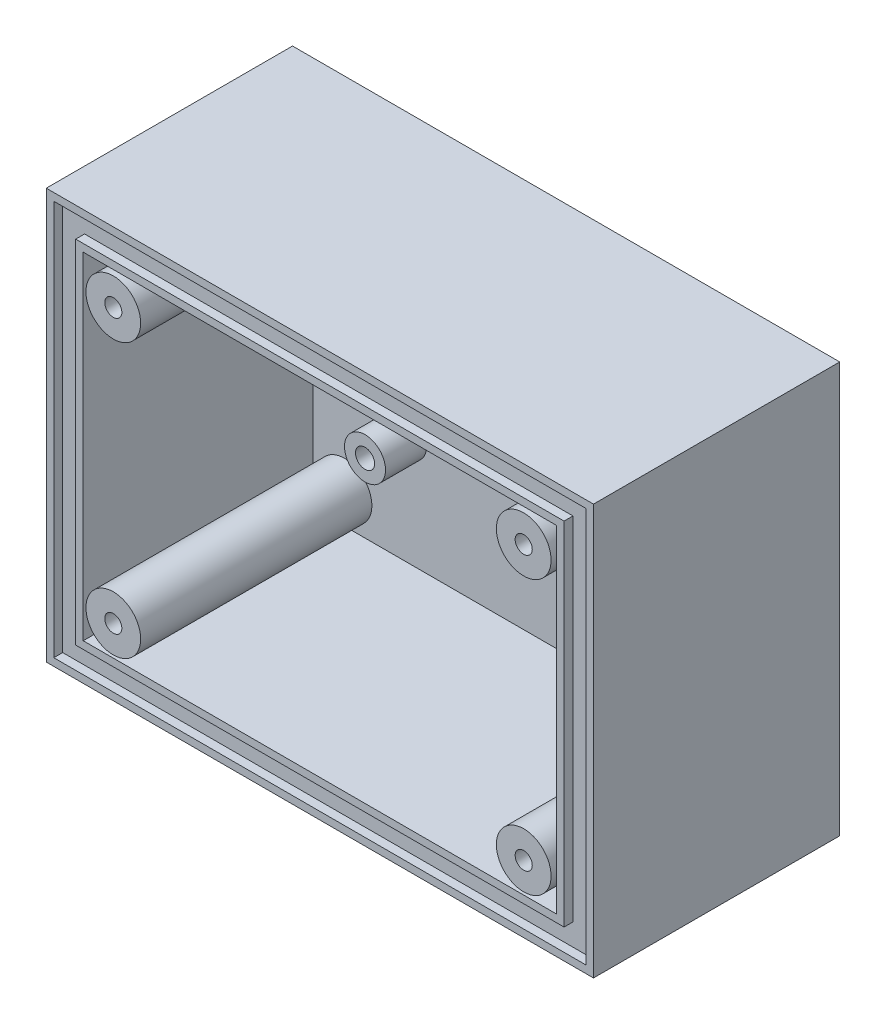
ISO-10303-21;
HEADER;
FILE_DESCRIPTION(('STEP AP214'),'2;1');
FILE_NAME('part.step','',(''),(''),'','','');
FILE_SCHEMA(('AUTOMOTIVE_DESIGN { 1 0 10303 214 1 1 1 1 }'));
ENDSEC;
DATA;
#1=APPLICATION_CONTEXT('core data for automotive mechanical design processes');
#2=APPLICATION_PROTOCOL_DEFINITION('international standard','automotive_design',2000,#1);
#3=PRODUCT_CONTEXT('',#1,'mechanical');
#4=PRODUCT('Part','Part','',(#3));
#5=PRODUCT_RELATED_PRODUCT_CATEGORY('part','',(#4));
#6=PRODUCT_DEFINITION_FORMATION('','',#4);
#7=PRODUCT_DEFINITION_CONTEXT('part definition',#1,'design');
#8=PRODUCT_DEFINITION('design','',#6,#7);
#9=PRODUCT_DEFINITION_SHAPE('','',#8);
#10=(LENGTH_UNIT() NAMED_UNIT(*) SI_UNIT(.MILLI.,.METRE.));
#11=(NAMED_UNIT(*) PLANE_ANGLE_UNIT() SI_UNIT($,.RADIAN.));
#12=(NAMED_UNIT(*) SI_UNIT($,.STERADIAN.) SOLID_ANGLE_UNIT());
#13=UNCERTAINTY_MEASURE_WITH_UNIT(LENGTH_MEASURE(1.E-05),#10,'distance_accuracy_value','');
#14=(GEOMETRIC_REPRESENTATION_CONTEXT(3) GLOBAL_UNCERTAINTY_ASSIGNED_CONTEXT((#13)) GLOBAL_UNIT_ASSIGNED_CONTEXT((#10,
#11,#12)) REPRESENTATION_CONTEXT('',''));
#15=CARTESIAN_POINT('',(0.,0.,0.));
#16=DIRECTION('',(0.,0.,1.));
#17=DIRECTION('',(1.,0.,0.));
#18=AXIS2_PLACEMENT_3D('',#15,#16,#17);
#19=CARTESIAN_POINT('',(0.,0.,34.7));
#20=DIRECTION('',(0.,0.,-1.));
#21=DIRECTION('',(-1.,0.,0.));
#22=AXIS2_PLACEMENT_3D('',#19,#20,#21);
#23=PLANE('',#22);
#24=DIRECTION('',(-1.,0.,0.));
#25=VECTOR('',#24,1.);
#26=CARTESIAN_POINT('',(-38.9,28.9,34.7));
#27=LINE('',#26,#25);
#28=CARTESIAN_POINT('',(38.9,28.9,34.7));
#29=VERTEX_POINT('',#28);
#30=CARTESIAN_POINT('',(-38.9,28.9,34.7));
#31=VERTEX_POINT('',#30);
#32=EDGE_CURVE('E216',#29,#31,#27,.T.);
#33=ORIENTED_EDGE('',*,*,#32,.T.);
#34=DIRECTION('',(0.,-1.,0.));
#35=VECTOR('',#34,1.);
#36=CARTESIAN_POINT('',(-38.9,-28.9,34.7));
#37=LINE('',#36,#35);
#38=CARTESIAN_POINT('',(-38.9,-28.9,34.7));
#39=VERTEX_POINT('',#38);
#40=EDGE_CURVE('E212',#31,#39,#37,.T.);
#41=ORIENTED_EDGE('',*,*,#40,.T.);
#42=DIRECTION('',(1.,0.,0.));
#43=VECTOR('',#42,1.);
#44=CARTESIAN_POINT('',(-38.9,-28.9,34.7));
#45=LINE('',#44,#43);
#46=CARTESIAN_POINT('',(38.9,-28.9,34.7));
#47=VERTEX_POINT('',#46);
#48=EDGE_CURVE('E226',#39,#47,#45,.T.);
#49=ORIENTED_EDGE('',*,*,#48,.T.);
#50=DIRECTION('',(0.,1.,0.));
#51=VECTOR('',#50,1.);
#52=CARTESIAN_POINT('',(38.9,-28.9,34.7));
#53=LINE('',#52,#51);
#54=EDGE_CURVE('E229',#47,#29,#53,.T.);
#55=ORIENTED_EDGE('',*,*,#54,.T.);
#56=EDGE_LOOP('',(#33,#41,#49,#55));
#57=FACE_BOUND('',#56,.T.);
#58=DIRECTION('',(0.,-1.,0.));
#59=VECTOR('',#58,1.);
#60=CARTESIAN_POINT('',(-35.7,-25.7,34.7));
#61=LINE('',#60,#59);
#62=CARTESIAN_POINT('',(-35.7,25.7,34.7));
#63=VERTEX_POINT('',#62);
#64=CARTESIAN_POINT('',(-35.7,-25.7,34.7));
#65=VERTEX_POINT('',#64);
#66=EDGE_CURVE('E184',#63,#65,#61,.T.);
#67=ORIENTED_EDGE('',*,*,#66,.F.);
#68=DIRECTION('',(-1.,0.,0.));
#69=VECTOR('',#68,1.);
#70=CARTESIAN_POINT('',(-35.7,25.7,34.7));
#71=LINE('',#70,#69);
#72=CARTESIAN_POINT('',(35.7,25.7,34.7));
#73=VERTEX_POINT('',#72);
#74=EDGE_CURVE('E189',#73,#63,#71,.T.);
#75=ORIENTED_EDGE('',*,*,#74,.F.);
#76=DIRECTION('',(0.,1.,0.));
#77=VECTOR('',#76,1.);
#78=CARTESIAN_POINT('',(35.7,-25.7,34.7));
#79=LINE('',#78,#77);
#80=CARTESIAN_POINT('',(35.7,-25.7,34.7));
#81=VERTEX_POINT('',#80);
#82=EDGE_CURVE('E61',#81,#73,#79,.T.);
#83=ORIENTED_EDGE('',*,*,#82,.F.);
#84=DIRECTION('',(1.,0.,0.));
#85=VECTOR('',#84,1.);
#86=CARTESIAN_POINT('',(-35.7,-25.7,34.7));
#87=LINE('',#86,#85);
#88=EDGE_CURVE('E56',#65,#81,#87,.T.);
#89=ORIENTED_EDGE('',*,*,#88,.F.);
#90=EDGE_LOOP('',(#67,#75,#83,#89));
#91=FACE_BOUND('',#90,.T.);
#92=ADVANCED_FACE('F41',(#57,#91),#23,.F.);
#93=CARTESIAN_POINT('',(0.,0.,36.));
#94=DIRECTION('',(0.,0.,-1.));
#95=DIRECTION('',(-1.,0.,0.));
#96=AXIS2_PLACEMENT_3D('',#93,#94,#95);
#97=PLANE('',#96);
#98=DIRECTION('',(0.,-1.,0.));
#99=VECTOR('',#98,1.);
#100=CARTESIAN_POINT('',(-40.,-30.,36.));
#101=LINE('',#100,#99);
#102=CARTESIAN_POINT('',(-40.,30.,36.));
#103=VERTEX_POINT('',#102);
#104=CARTESIAN_POINT('',(-40.,-30.,36.));
#105=VERTEX_POINT('',#104);
#106=EDGE_CURVE('E242',#103,#105,#101,.T.);
#107=ORIENTED_EDGE('',*,*,#106,.T.);
#108=DIRECTION('',(1.,0.,0.));
#109=VECTOR('',#108,1.);
#110=CARTESIAN_POINT('',(-40.,-30.,36.));
#111=LINE('',#110,#109);
#112=CARTESIAN_POINT('',(40.,-30.,36.));
#113=VERTEX_POINT('',#112);
#114=EDGE_CURVE('E245',#105,#113,#111,.T.);
#115=ORIENTED_EDGE('',*,*,#114,.T.);
#116=DIRECTION('',(0.,1.,0.));
#117=VECTOR('',#116,1.);
#118=CARTESIAN_POINT('',(40.,-30.,36.));
#119=LINE('',#118,#117);
#120=CARTESIAN_POINT('',(40.,30.,36.));
#121=VERTEX_POINT('',#120);
#122=EDGE_CURVE('E248',#113,#121,#119,.T.);
#123=ORIENTED_EDGE('',*,*,#122,.T.);
#124=DIRECTION('',(-1.,0.,0.));
#125=VECTOR('',#124,1.);
#126=CARTESIAN_POINT('',(-40.,30.,36.));
#127=LINE('',#126,#125);
#128=EDGE_CURVE('E251',#121,#103,#127,.T.);
#129=ORIENTED_EDGE('',*,*,#128,.T.);
#130=EDGE_LOOP('',(#107,#115,#123,#129));
#131=FACE_BOUND('',#130,.T.);
#132=DIRECTION('',(0.,-1.,0.));
#133=VECTOR('',#132,1.);
#134=CARTESIAN_POINT('',(-38.9,-28.9,36.));
#135=LINE('',#134,#133);
#136=CARTESIAN_POINT('',(-38.9,28.9,36.));
#137=VERTEX_POINT('',#136);
#138=CARTESIAN_POINT('',(-38.9,-28.9,36.));
#139=VERTEX_POINT('',#138);
#140=EDGE_CURVE('E213',#137,#139,#135,.T.);
#141=ORIENTED_EDGE('',*,*,#140,.F.);
#142=DIRECTION('',(-1.,0.,0.));
#143=VECTOR('',#142,1.);
#144=CARTESIAN_POINT('',(-38.9,28.9,36.));
#145=LINE('',#144,#143);
#146=CARTESIAN_POINT('',(38.9,28.9,36.));
#147=VERTEX_POINT('',#146);
#148=EDGE_CURVE('E221',#147,#137,#145,.T.);
#149=ORIENTED_EDGE('',*,*,#148,.F.);
#150=DIRECTION('',(0.,1.,0.));
#151=VECTOR('',#150,1.);
#152=CARTESIAN_POINT('',(38.9,-28.9,36.));
#153=LINE('',#152,#151);
#154=CARTESIAN_POINT('',(38.9,-28.9,36.));
#155=VERTEX_POINT('',#154);
#156=EDGE_CURVE('E218',#155,#147,#153,.T.);
#157=ORIENTED_EDGE('',*,*,#156,.F.);
#158=DIRECTION('',(1.,0.,0.));
#159=VECTOR('',#158,1.);
#160=CARTESIAN_POINT('',(-38.9,-28.9,36.));
#161=LINE('',#160,#159);
#162=EDGE_CURVE('E215',#139,#155,#161,.T.);
#163=ORIENTED_EDGE('',*,*,#162,.F.);
#164=EDGE_LOOP('',(#141,#149,#157,#163));
#165=FACE_BOUND('',#164,.T.);
#166=ADVANCED_FACE('F344',(#131,#165),#97,.F.);
#167=CARTESIAN_POINT('',(-38.9,-28.9,36.));
#168=DIRECTION('',(1.,0.,0.));
#169=DIRECTION('',(0.,0.,-1.));
#170=AXIS2_PLACEMENT_3D('',#167,#168,#169);
#171=PLANE('',#170);
#172=ORIENTED_EDGE('',*,*,#40,.F.);
#173=DIRECTION('',(0.,0.,-1.));
#174=VECTOR('',#173,1.);
#175=CARTESIAN_POINT('',(-38.9,28.9,36.));
#176=LINE('',#175,#174);
#177=EDGE_CURVE('E223',#137,#31,#176,.T.);
#178=ORIENTED_EDGE('',*,*,#177,.F.);
#179=ORIENTED_EDGE('',*,*,#140,.T.);
#180=DIRECTION('',(0.,0.,-1.));
#181=VECTOR('',#180,1.);
#182=CARTESIAN_POINT('',(-38.9,-28.9,36.));
#183=LINE('',#182,#181);
#184=EDGE_CURVE('E239',#139,#39,#183,.T.);
#185=ORIENTED_EDGE('',*,*,#184,.T.);
#186=EDGE_LOOP('',(#172,#178,#179,#185));
#187=FACE_BOUND('',#186,.T.);
#188=ADVANCED_FACE('F352',(#187),#171,.T.);
#189=CARTESIAN_POINT('',(-38.9,-28.9,36.));
#190=DIRECTION('',(0.,1.,0.));
#191=DIRECTION('',(0.,0.,1.));
#192=AXIS2_PLACEMENT_3D('',#189,#190,#191);
#193=PLANE('',#192);
#194=ORIENTED_EDGE('',*,*,#48,.F.);
#195=ORIENTED_EDGE('',*,*,#184,.F.);
#196=ORIENTED_EDGE('',*,*,#162,.T.);
#197=DIRECTION('',(0.,0.,-1.));
#198=VECTOR('',#197,1.);
#199=CARTESIAN_POINT('',(38.9,-28.9,36.));
#200=LINE('',#199,#198);
#201=EDGE_CURVE('E237',#155,#47,#200,.T.);
#202=ORIENTED_EDGE('',*,*,#201,.T.);
#203=EDGE_LOOP('',(#194,#195,#196,#202));
#204=FACE_BOUND('',#203,.T.);
#205=ADVANCED_FACE('F392',(#204),#193,.T.);
#206=CARTESIAN_POINT('',(38.9,-28.9,36.));
#207=DIRECTION('',(-1.,0.,0.));
#208=DIRECTION('',(0.,0.,1.));
#209=AXIS2_PLACEMENT_3D('',#206,#207,#208);
#210=PLANE('',#209);
#211=ORIENTED_EDGE('',*,*,#54,.F.);
#212=ORIENTED_EDGE('',*,*,#201,.F.);
#213=ORIENTED_EDGE('',*,*,#156,.T.);
#214=DIRECTION('',(0.,0.,-1.));
#215=VECTOR('',#214,1.);
#216=CARTESIAN_POINT('',(38.9,28.9,36.));
#217=LINE('',#216,#215);
#218=EDGE_CURVE('E235',#147,#29,#217,.T.);
#219=ORIENTED_EDGE('',*,*,#218,.T.);
#220=EDGE_LOOP('',(#211,#212,#213,#219));
#221=FACE_BOUND('',#220,.T.);
#222=ADVANCED_FACE('F398',(#221),#210,.T.);
#223=CARTESIAN_POINT('',(-38.9,28.9,36.));
#224=DIRECTION('',(0.,-1.,0.));
#225=DIRECTION('',(0.,0.,-1.));
#226=AXIS2_PLACEMENT_3D('',#223,#224,#225);
#227=PLANE('',#226);
#228=ORIENTED_EDGE('',*,*,#32,.F.);
#229=ORIENTED_EDGE('',*,*,#218,.F.);
#230=ORIENTED_EDGE('',*,*,#148,.T.);
#231=ORIENTED_EDGE('',*,*,#177,.T.);
#232=EDGE_LOOP('',(#228,#229,#230,#231));
#233=FACE_BOUND('',#232,.T.);
#234=ADVANCED_FACE('F361',(#233),#227,.T.);
#235=CARTESIAN_POINT('',(0.,0.,0.));
#236=DIRECTION('',(0.,0.,-1.));
#237=DIRECTION('',(-1.,0.,0.));
#238=AXIS2_PLACEMENT_3D('',#235,#236,#237);
#239=PLANE('',#238);
#240=DIRECTION('',(0.,-1.,0.));
#241=VECTOR('',#240,1.);
#242=CARTESIAN_POINT('',(-40.,-30.,0.));
#243=LINE('',#242,#241);
#244=CARTESIAN_POINT('',(-40.,30.,0.));
#245=VERTEX_POINT('',#244);
#246=CARTESIAN_POINT('',(-40.,-30.,0.));
#247=VERTEX_POINT('',#246);
#248=EDGE_CURVE('E163',#245,#247,#243,.T.);
#249=ORIENTED_EDGE('',*,*,#248,.F.);
#250=DIRECTION('',(-1.,0.,0.));
#251=VECTOR('',#250,1.);
#252=CARTESIAN_POINT('',(-40.,30.,0.));
#253=LINE('',#252,#251);
#254=CARTESIAN_POINT('',(40.,30.,0.));
#255=VERTEX_POINT('',#254);
#256=EDGE_CURVE('E273',#255,#245,#253,.T.);
#257=ORIENTED_EDGE('',*,*,#256,.F.);
#258=DIRECTION('',(0.,1.,0.));
#259=VECTOR('',#258,1.);
#260=CARTESIAN_POINT('',(40.,-30.,0.));
#261=LINE('',#260,#259);
#262=CARTESIAN_POINT('',(40.,-30.,0.));
#263=VERTEX_POINT('',#262);
#264=EDGE_CURVE('E271',#263,#255,#261,.T.);
#265=ORIENTED_EDGE('',*,*,#264,.F.);
#266=DIRECTION('',(1.,0.,0.));
#267=VECTOR('',#266,1.);
#268=CARTESIAN_POINT('',(-40.,-30.,0.));
#269=LINE('',#268,#267);
#270=EDGE_CURVE('E269',#247,#263,#269,.T.);
#271=ORIENTED_EDGE('',*,*,#270,.F.);
#272=EDGE_LOOP('',(#249,#257,#265,#271));
#273=FACE_BOUND('',#272,.T.);
#274=ADVANCED_FACE('F357',(#273),#239,.T.);
#275=CARTESIAN_POINT('',(-40.,30.,2.4));
#276=DIRECTION('',(0.,-1.,0.));
#277=DIRECTION('',(0.,0.,-1.));
#278=AXIS2_PLACEMENT_3D('',#275,#276,#277);
#279=PLANE('',#278);
#280=ORIENTED_EDGE('',*,*,#256,.T.);
#281=DIRECTION('',(0.,0.,-1.));
#282=VECTOR('',#281,1.);
#283=CARTESIAN_POINT('',(-40.,30.,2.4));
#284=LINE('',#283,#282);
#285=EDGE_CURVE('E275',#103,#245,#284,.T.);
#286=ORIENTED_EDGE('',*,*,#285,.F.);
#287=ORIENTED_EDGE('',*,*,#128,.F.);
#288=DIRECTION('',(0.,0.,-1.));
#289=VECTOR('',#288,1.);
#290=CARTESIAN_POINT('',(40.,30.,2.4));
#291=LINE('',#290,#289);
#292=EDGE_CURVE('E278',#121,#255,#291,.T.);
#293=ORIENTED_EDGE('',*,*,#292,.T.);
#294=EDGE_LOOP('',(#280,#286,#287,#293));
#295=FACE_BOUND('',#294,.T.);
#296=ADVANCED_FACE('F360',(#295),#279,.F.);
#297=CARTESIAN_POINT('',(40.,-30.,2.4));
#298=DIRECTION('',(-1.,0.,0.));
#299=DIRECTION('',(0.,0.,1.));
#300=AXIS2_PLACEMENT_3D('',#297,#298,#299);
#301=PLANE('',#300);
#302=ORIENTED_EDGE('',*,*,#264,.T.);
#303=ORIENTED_EDGE('',*,*,#292,.F.);
#304=ORIENTED_EDGE('',*,*,#122,.F.);
#305=DIRECTION('',(0.,0.,-1.));
#306=VECTOR('',#305,1.);
#307=CARTESIAN_POINT('',(40.,-30.,2.4));
#308=LINE('',#307,#306);
#309=EDGE_CURVE('E281',#113,#263,#308,.T.);
#310=ORIENTED_EDGE('',*,*,#309,.T.);
#311=EDGE_LOOP('',(#302,#303,#304,#310));
#312=FACE_BOUND('',#311,.T.);
#313=ADVANCED_FACE('F365',(#312),#301,.F.);
#314=CARTESIAN_POINT('',(-40.,-30.,2.4));
#315=DIRECTION('',(0.,1.,0.));
#316=DIRECTION('',(0.,0.,1.));
#317=AXIS2_PLACEMENT_3D('',#314,#315,#316);
#318=PLANE('',#317);
#319=ORIENTED_EDGE('',*,*,#270,.T.);
#320=ORIENTED_EDGE('',*,*,#309,.F.);
#321=ORIENTED_EDGE('',*,*,#114,.F.);
#322=DIRECTION('',(0.,0.,-1.));
#323=VECTOR('',#322,1.);
#324=CARTESIAN_POINT('',(-40.,-30.,2.4));
#325=LINE('',#324,#323);
#326=EDGE_CURVE('E284',#105,#247,#325,.T.);
#327=ORIENTED_EDGE('',*,*,#326,.T.);
#328=EDGE_LOOP('',(#319,#320,#321,#327));
#329=FACE_BOUND('',#328,.T.);
#330=ADVANCED_FACE('F368',(#329),#318,.F.);
#331=CARTESIAN_POINT('',(-40.,-30.,2.4));
#332=DIRECTION('',(1.,0.,0.));
#333=DIRECTION('',(0.,0.,-1.));
#334=AXIS2_PLACEMENT_3D('',#331,#332,#333);
#335=PLANE('',#334);
#336=ORIENTED_EDGE('',*,*,#248,.T.);
#337=ORIENTED_EDGE('',*,*,#326,.F.);
#338=ORIENTED_EDGE('',*,*,#106,.F.);
#339=ORIENTED_EDGE('',*,*,#285,.T.);
#340=EDGE_LOOP('',(#336,#337,#338,#339));
#341=FACE_BOUND('',#340,.T.);
#342=ADVANCED_FACE('F43',(#341),#335,.F.);
#343=CARTESIAN_POINT('',(0.,0.,36.));
#344=DIRECTION('',(0.,0.,-1.));
#345=DIRECTION('',(-1.,0.,0.));
#346=AXIS2_PLACEMENT_3D('',#343,#344,#345);
#347=PLANE('',#346);
#348=DIRECTION('',(0.,-1.,0.));
#349=VECTOR('',#348,1.);
#350=CARTESIAN_POINT('',(-35.7,-25.7,36.));
#351=LINE('',#350,#349);
#352=CARTESIAN_POINT('',(-35.7,25.7,36.));
#353=VERTEX_POINT('',#352);
#354=CARTESIAN_POINT('',(-35.7,-25.7,36.));
#355=VERTEX_POINT('',#354);
#356=EDGE_CURVE('E185',#353,#355,#351,.T.);
#357=ORIENTED_EDGE('',*,*,#356,.T.);
#358=DIRECTION('',(1.,0.,0.));
#359=VECTOR('',#358,1.);
#360=CARTESIAN_POINT('',(-35.7,-25.7,36.));
#361=LINE('',#360,#359);
#362=CARTESIAN_POINT('',(35.7,-25.7,36.));
#363=VERTEX_POINT('',#362);
#364=EDGE_CURVE('E188',#355,#363,#361,.T.);
#365=ORIENTED_EDGE('',*,*,#364,.T.);
#366=DIRECTION('',(0.,1.,0.));
#367=VECTOR('',#366,1.);
#368=CARTESIAN_POINT('',(35.7,-25.7,36.));
#369=LINE('',#368,#367);
#370=CARTESIAN_POINT('',(35.7,25.7,36.));
#371=VERTEX_POINT('',#370);
#372=EDGE_CURVE('E191',#363,#371,#369,.T.);
#373=ORIENTED_EDGE('',*,*,#372,.T.);
#374=DIRECTION('',(-1.,0.,0.));
#375=VECTOR('',#374,1.);
#376=CARTESIAN_POINT('',(-35.7,25.7,36.));
#377=LINE('',#376,#375);
#378=EDGE_CURVE('E193',#371,#353,#377,.T.);
#379=ORIENTED_EDGE('',*,*,#378,.T.);
#380=EDGE_LOOP('',(#357,#365,#373,#379));
#381=FACE_BOUND('',#380,.T.);
#382=DIRECTION('',(0.,-1.,0.));
#383=VECTOR('',#382,1.);
#384=CARTESIAN_POINT('',(-34.6,-24.6,36.));
#385=LINE('',#384,#383);
#386=CARTESIAN_POINT('',(-34.6,24.6,36.));
#387=VERTEX_POINT('',#386);
#388=CARTESIAN_POINT('',(-34.6,-24.6,36.));
#389=VERTEX_POINT('',#388);
#390=EDGE_CURVE('E167',#387,#389,#385,.T.);
#391=ORIENTED_EDGE('',*,*,#390,.F.);
#392=DIRECTION('',(-1.,0.,0.));
#393=VECTOR('',#392,1.);
#394=CARTESIAN_POINT('',(-34.6,24.6,36.));
#395=LINE('',#394,#393);
#396=CARTESIAN_POINT('',(34.6,24.6,36.));
#397=VERTEX_POINT('',#396);
#398=EDGE_CURVE('E179',#397,#387,#395,.T.);
#399=ORIENTED_EDGE('',*,*,#398,.F.);
#400=DIRECTION('',(0.,1.,0.));
#401=VECTOR('',#400,1.);
#402=CARTESIAN_POINT('',(34.6,-24.6,36.));
#403=LINE('',#402,#401);
#404=CARTESIAN_POINT('',(34.6,-24.6,36.));
#405=VERTEX_POINT('',#404);
#406=EDGE_CURVE('E177',#405,#397,#403,.T.);
#407=ORIENTED_EDGE('',*,*,#406,.F.);
#408=DIRECTION('',(1.,0.,0.));
#409=VECTOR('',#408,1.);
#410=CARTESIAN_POINT('',(-34.6,-24.6,36.));
#411=LINE('',#410,#409);
#412=EDGE_CURVE('E156',#389,#405,#411,.T.);
#413=ORIENTED_EDGE('',*,*,#412,.F.);
#414=EDGE_LOOP('',(#391,#399,#407,#413));
#415=FACE_BOUND('',#414,.T.);
#416=ADVANCED_FACE('F175',(#381,#415),#347,.F.);
#417=CARTESIAN_POINT('',(-35.7,-25.7,36.));
#418=DIRECTION('',(1.,0.,0.));
#419=DIRECTION('',(0.,0.,-1.));
#420=AXIS2_PLACEMENT_3D('',#417,#418,#419);
#421=PLANE('',#420);
#422=ORIENTED_EDGE('',*,*,#66,.T.);
#423=DIRECTION('',(0.,0.,-1.));
#424=VECTOR('',#423,1.);
#425=CARTESIAN_POINT('',(-35.7,-25.7,36.));
#426=LINE('',#425,#424);
#427=EDGE_CURVE('E210',#355,#65,#426,.T.);
#428=ORIENTED_EDGE('',*,*,#427,.F.);
#429=ORIENTED_EDGE('',*,*,#356,.F.);
#430=DIRECTION('',(0.,0.,-1.));
#431=VECTOR('',#430,1.);
#432=CARTESIAN_POINT('',(-35.7,25.7,36.));
#433=LINE('',#432,#431);
#434=EDGE_CURVE('E195',#353,#63,#433,.T.);
#435=ORIENTED_EDGE('',*,*,#434,.T.);
#436=EDGE_LOOP('',(#422,#428,#429,#435));
#437=FACE_BOUND('',#436,.T.);
#438=ADVANCED_FACE('F474',(#437),#421,.F.);
#439=CARTESIAN_POINT('',(-35.7,-25.7,36.));
#440=DIRECTION('',(0.,1.,0.));
#441=DIRECTION('',(0.,0.,1.));
#442=AXIS2_PLACEMENT_3D('',#439,#440,#441);
#443=PLANE('',#442);
#444=ORIENTED_EDGE('',*,*,#88,.T.);
#445=DIRECTION('',(0.,0.,-1.));
#446=VECTOR('',#445,1.);
#447=CARTESIAN_POINT('',(35.7,-25.7,36.));
#448=LINE('',#447,#446);
#449=EDGE_CURVE('E207',#363,#81,#448,.T.);
#450=ORIENTED_EDGE('',*,*,#449,.F.);
#451=ORIENTED_EDGE('',*,*,#364,.F.);
#452=ORIENTED_EDGE('',*,*,#427,.T.);
#453=EDGE_LOOP('',(#444,#450,#451,#452));
#454=FACE_BOUND('',#453,.T.);
#455=ADVANCED_FACE('F484',(#454),#443,.F.);
#456=CARTESIAN_POINT('',(35.7,-25.7,36.));
#457=DIRECTION('',(-1.,0.,0.));
#458=DIRECTION('',(0.,0.,1.));
#459=AXIS2_PLACEMENT_3D('',#456,#457,#458);
#460=PLANE('',#459);
#461=ORIENTED_EDGE('',*,*,#82,.T.);
#462=DIRECTION('',(0.,0.,-1.));
#463=VECTOR('',#462,1.);
#464=CARTESIAN_POINT('',(35.7,25.7,36.));
#465=LINE('',#464,#463);
#466=EDGE_CURVE('E204',#371,#73,#465,.T.);
#467=ORIENTED_EDGE('',*,*,#466,.F.);
#468=ORIENTED_EDGE('',*,*,#372,.F.);
#469=ORIENTED_EDGE('',*,*,#449,.T.);
#470=EDGE_LOOP('',(#461,#467,#468,#469));
#471=FACE_BOUND('',#470,.T.);
#472=ADVANCED_FACE('F493',(#471),#460,.F.);
#473=CARTESIAN_POINT('',(-35.7,25.7,36.));
#474=DIRECTION('',(0.,-1.,0.));
#475=DIRECTION('',(0.,0.,-1.));
#476=AXIS2_PLACEMENT_3D('',#473,#474,#475);
#477=PLANE('',#476);
#478=ORIENTED_EDGE('',*,*,#74,.T.);
#479=ORIENTED_EDGE('',*,*,#434,.F.);
#480=ORIENTED_EDGE('',*,*,#378,.F.);
#481=ORIENTED_EDGE('',*,*,#466,.T.);
#482=EDGE_LOOP('',(#478,#479,#480,#481));
#483=FACE_BOUND('',#482,.T.);
#484=ADVANCED_FACE('F313',(#483),#477,.F.);
#485=CARTESIAN_POINT('',(0.,0.,2.4));
#486=DIRECTION('',(0.,0.,-1.));
#487=DIRECTION('',(-1.,0.,0.));
#488=AXIS2_PLACEMENT_3D('',#485,#486,#487);
#489=PLANE('',#488);
#490=CARTESIAN_POINT('',(21.,8.5,2.4));
#491=DIRECTION('',(0.,0.,-1.));
#492=DIRECTION('',(-1.,0.,0.));
#493=AXIS2_PLACEMENT_3D('',#490,#491,#492);
#494=CIRCLE('',#493,3.);
#495=CARTESIAN_POINT('',(18.,8.5,2.4));
#496=VERTEX_POINT('',#495);
#497=EDGE_CURVE('E11',#496,#496,#494,.F.);
#498=ORIENTED_EDGE('',*,*,#497,.F.);
#499=EDGE_LOOP('',(#498));
#500=FACE_BOUND('',#499,.T.);
#501=CARTESIAN_POINT('',(21.,-8.5,2.4));
#502=DIRECTION('',(0.,0.,-1.));
#503=DIRECTION('',(-1.,0.,0.));
#504=AXIS2_PLACEMENT_3D('',#501,#502,#503);
#505=CIRCLE('',#504,3.);
#506=CARTESIAN_POINT('',(18.,-8.5,2.4));
#507=VERTEX_POINT('',#506);
#508=EDGE_CURVE('E49',#507,#507,#505,.F.);
#509=ORIENTED_EDGE('',*,*,#508,.F.);
#510=EDGE_LOOP('',(#509));
#511=FACE_BOUND('',#510,.T.);
#512=CARTESIAN_POINT('',(-21.,8.5,2.4));
#513=DIRECTION('',(0.,0.,-1.));
#514=DIRECTION('',(-1.,0.,0.));
#515=AXIS2_PLACEMENT_3D('',#512,#513,#514);
#516=CIRCLE('',#515,3.);
#517=CARTESIAN_POINT('',(-24.,8.5,2.4));
#518=VERTEX_POINT('',#517);
#519=EDGE_CURVE('E302',#518,#518,#516,.F.);
#520=ORIENTED_EDGE('',*,*,#519,.F.);
#521=EDGE_LOOP('',(#520));
#522=FACE_BOUND('',#521,.T.);
#523=CARTESIAN_POINT('',(-21.,-8.5,2.4));
#524=DIRECTION('',(0.,0.,-1.));
#525=DIRECTION('',(-1.,0.,0.));
#526=AXIS2_PLACEMENT_3D('',#523,#524,#525);
#527=CIRCLE('',#526,3.);
#528=CARTESIAN_POINT('',(-24.,-8.5,2.4));
#529=VERTEX_POINT('',#528);
#530=EDGE_CURVE('E299',#529,#529,#527,.F.);
#531=ORIENTED_EDGE('',*,*,#530,.F.);
#532=EDGE_LOOP('',(#531));
#533=FACE_BOUND('',#532,.T.);
#534=CARTESIAN_POINT('',(30.,20.,2.4));
#535=DIRECTION('',(0.,0.,-1.));
#536=DIRECTION('',(-1.,0.,0.));
#537=AXIS2_PLACEMENT_3D('',#534,#535,#536);
#538=CIRCLE('',#537,4.00000000000001);
#539=CARTESIAN_POINT('',(26.,20.,2.4));
#540=VERTEX_POINT('',#539);
#541=EDGE_CURVE('E296',#540,#540,#538,.F.);
#542=ORIENTED_EDGE('',*,*,#541,.F.);
#543=EDGE_LOOP('',(#542));
#544=FACE_BOUND('',#543,.T.);
#545=CARTESIAN_POINT('',(30.,-20.,2.4));
#546=DIRECTION('',(0.,0.,-1.));
#547=DIRECTION('',(-1.,0.,0.));
#548=AXIS2_PLACEMENT_3D('',#545,#546,#547);
#549=CIRCLE('',#548,4.00000000000001);
#550=CARTESIAN_POINT('',(26.,-20.,2.4));
#551=VERTEX_POINT('',#550);
#552=EDGE_CURVE('E293',#551,#551,#549,.F.);
#553=ORIENTED_EDGE('',*,*,#552,.F.);
#554=EDGE_LOOP('',(#553));
#555=FACE_BOUND('',#554,.T.);
#556=CARTESIAN_POINT('',(-30.,20.,2.4));
#557=DIRECTION('',(0.,0.,-1.));
#558=DIRECTION('',(-1.,0.,0.));
#559=AXIS2_PLACEMENT_3D('',#556,#557,#558);
#560=CIRCLE('',#559,4.);
#561=CARTESIAN_POINT('',(-34.,20.,2.4));
#562=VERTEX_POINT('',#561);
#563=EDGE_CURVE('E290',#562,#562,#560,.F.);
#564=ORIENTED_EDGE('',*,*,#563,.F.);
#565=EDGE_LOOP('',(#564));
#566=FACE_BOUND('',#565,.T.);
#567=CARTESIAN_POINT('',(-30.,-20.,2.4));
#568=DIRECTION('',(0.,0.,-1.));
#569=DIRECTION('',(-1.,0.,0.));
#570=AXIS2_PLACEMENT_3D('',#567,#568,#569);
#571=CIRCLE('',#570,4.);
#572=CARTESIAN_POINT('',(-34.,-20.,2.4));
#573=VERTEX_POINT('',#572);
#574=EDGE_CURVE('E287',#573,#573,#571,.F.);
#575=ORIENTED_EDGE('',*,*,#574,.F.);
#576=EDGE_LOOP('',(#575));
#577=FACE_BOUND('',#576,.T.);
#578=DIRECTION('',(-1.,0.,0.));
#579=VECTOR('',#578,1.);
#580=CARTESIAN_POINT('',(-34.6,24.6,2.4));
#581=LINE('',#580,#579);
#582=CARTESIAN_POINT('',(34.6,24.6,2.4));
#583=VERTEX_POINT('',#582);
#584=CARTESIAN_POINT('',(-34.6,24.6,2.4));
#585=VERTEX_POINT('',#584);
#586=EDGE_CURVE('E260',#583,#585,#581,.T.);
#587=ORIENTED_EDGE('',*,*,#586,.T.);
#588=DIRECTION('',(0.,-1.,0.));
#589=VECTOR('',#588,1.);
#590=CARTESIAN_POINT('',(-34.6,-24.6,2.4));
#591=LINE('',#590,#589);
#592=CARTESIAN_POINT('',(-34.6,-24.6,2.4));
#593=VERTEX_POINT('',#592);
#594=EDGE_CURVE('E254',#585,#593,#591,.T.);
#595=ORIENTED_EDGE('',*,*,#594,.T.);
#596=DIRECTION('',(1.,0.,0.));
#597=VECTOR('',#596,1.);
#598=CARTESIAN_POINT('',(-34.6,-24.6,2.4));
#599=LINE('',#598,#597);
#600=CARTESIAN_POINT('',(34.6,-24.6,2.4));
#601=VERTEX_POINT('',#600);
#602=EDGE_CURVE('E159',#593,#601,#599,.T.);
#603=ORIENTED_EDGE('',*,*,#602,.T.);
#604=DIRECTION('',(0.,1.,0.));
#605=VECTOR('',#604,1.);
#606=CARTESIAN_POINT('',(34.6,-24.6,2.4));
#607=LINE('',#606,#605);
#608=EDGE_CURVE('E257',#601,#583,#607,.T.);
#609=ORIENTED_EDGE('',*,*,#608,.T.);
#610=EDGE_LOOP('',(#587,#595,#603,#609));
#611=FACE_BOUND('',#610,.T.);
#612=ADVANCED_FACE('F309',(#500,#511,#522,#533,#544,#555,#566,#577,#611),#489,.F.);
#613=CARTESIAN_POINT('',(-34.6,24.6,34.7));
#614=DIRECTION('',(0.,-1.,0.));
#615=DIRECTION('',(0.,0.,-1.));
#616=AXIS2_PLACEMENT_3D('',#613,#614,#615);
#617=PLANE('',#616);
#618=ORIENTED_EDGE('',*,*,#586,.F.);
#619=DIRECTION('',(0.,0.,-1.));
#620=VECTOR('',#619,1.);
#621=CARTESIAN_POINT('',(34.6,24.6,34.7));
#622=LINE('',#621,#620);
#623=EDGE_CURVE('E264',#397,#583,#622,.T.);
#624=ORIENTED_EDGE('',*,*,#623,.F.);
#625=ORIENTED_EDGE('',*,*,#398,.T.);
#626=DIRECTION('',(0.,0.,-1.));
#627=VECTOR('',#626,1.);
#628=CARTESIAN_POINT('',(-34.6,24.6,34.7));
#629=LINE('',#628,#627);
#630=EDGE_CURVE('E169',#387,#585,#629,.T.);
#631=ORIENTED_EDGE('',*,*,#630,.T.);
#632=EDGE_LOOP('',(#618,#624,#625,#631));
#633=FACE_BOUND('',#632,.T.);
#634=ADVANCED_FACE('F312',(#633),#617,.T.);
#635=CARTESIAN_POINT('',(34.6,-24.6,34.7));
#636=DIRECTION('',(-1.,0.,0.));
#637=DIRECTION('',(0.,0.,1.));
#638=AXIS2_PLACEMENT_3D('',#635,#636,#637);
#639=PLANE('',#638);
#640=ORIENTED_EDGE('',*,*,#608,.F.);
#641=DIRECTION('',(0.,0.,-1.));
#642=VECTOR('',#641,1.);
#643=CARTESIAN_POINT('',(34.6,-24.6,34.7));
#644=LINE('',#643,#642);
#645=EDGE_CURVE('E164',#405,#601,#644,.T.);
#646=ORIENTED_EDGE('',*,*,#645,.F.);
#647=ORIENTED_EDGE('',*,*,#406,.T.);
#648=ORIENTED_EDGE('',*,*,#623,.T.);
#649=EDGE_LOOP('',(#640,#646,#647,#648));
#650=FACE_BOUND('',#649,.T.);
#651=ADVANCED_FACE('F334',(#650),#639,.T.);
#652=CARTESIAN_POINT('',(-34.6,-24.6,34.7));
#653=DIRECTION('',(0.,1.,0.));
#654=DIRECTION('',(0.,0.,1.));
#655=AXIS2_PLACEMENT_3D('',#652,#653,#654);
#656=PLANE('',#655);
#657=ORIENTED_EDGE('',*,*,#602,.F.);
#658=DIRECTION('',(0.,0.,-1.));
#659=VECTOR('',#658,1.);
#660=CARTESIAN_POINT('',(-34.6,-24.6,34.7));
#661=LINE('',#660,#659);
#662=EDGE_CURVE('E152',#389,#593,#661,.T.);
#663=ORIENTED_EDGE('',*,*,#662,.F.);
#664=ORIENTED_EDGE('',*,*,#412,.T.);
#665=ORIENTED_EDGE('',*,*,#645,.T.);
#666=EDGE_LOOP('',(#657,#663,#664,#665));
#667=FACE_BOUND('',#666,.T.);
#668=ADVANCED_FACE('F154',(#667),#656,.T.);
#669=CARTESIAN_POINT('',(-34.6,-24.6,34.7));
#670=DIRECTION('',(1.,0.,0.));
#671=DIRECTION('',(0.,0.,-1.));
#672=AXIS2_PLACEMENT_3D('',#669,#670,#671);
#673=PLANE('',#672);
#674=ORIENTED_EDGE('',*,*,#594,.F.);
#675=ORIENTED_EDGE('',*,*,#630,.F.);
#676=ORIENTED_EDGE('',*,*,#390,.T.);
#677=ORIENTED_EDGE('',*,*,#662,.T.);
#678=EDGE_LOOP('',(#674,#675,#676,#677));
#679=FACE_BOUND('',#678,.T.);
#680=ADVANCED_FACE('F168',(#679),#673,.T.);
#681=CARTESIAN_POINT('',(-30.,-20.,36.2));
#682=DIRECTION('',(0.,0.,1.));
#683=DIRECTION('',(1.,0.,0.));
#684=AXIS2_PLACEMENT_3D('',#681,#682,#683);
#685=PLANE('',#684);
#686=CARTESIAN_POINT('',(-30.,-20.,36.2));
#687=DIRECTION('',(0.,0.,1.));
#688=DIRECTION('',(1.,0.,0.));
#689=AXIS2_PLACEMENT_3D('',#686,#687,#688);
#690=CIRCLE('',#689,4.);
#691=CARTESIAN_POINT('',(-26.,-20.,36.2));
#692=VERTEX_POINT('',#691);
#693=EDGE_CURVE('E173',#692,#692,#690,.T.);
#694=ORIENTED_EDGE('',*,*,#693,.T.);
#695=EDGE_LOOP('',(#694));
#696=FACE_BOUND('',#695,.T.);
#697=CARTESIAN_POINT('',(-30.,-20.,36.2));
#698=DIRECTION('',(0.,0.,1.));
#699=DIRECTION('',(1.,0.,0.));
#700=AXIS2_PLACEMENT_3D('',#697,#698,#699);
#701=CIRCLE('',#700,1.25);
#702=CARTESIAN_POINT('',(-28.75,-20.,36.2));
#703=VERTEX_POINT('',#702);
#704=EDGE_CURVE('E915',#703,#703,#701,.T.);
#705=ORIENTED_EDGE('',*,*,#704,.F.);
#706=EDGE_LOOP('',(#705));
#707=FACE_BOUND('',#706,.T.);
#708=ADVANCED_FACE('F543',(#696,#707),#685,.T.);
#709=CARTESIAN_POINT('',(-30.,-20.,36.2));
#710=DIRECTION('',(0.,0.,-1.));
#711=DIRECTION('',(-1.,0.,0.));
#712=AXIS2_PLACEMENT_3D('',#709,#710,#711);
#713=CYLINDRICAL_SURFACE('',#712,4.);
#714=ORIENTED_EDGE('',*,*,#693,.F.);
#715=EDGE_LOOP('',(#714));
#716=FACE_BOUND('',#715,.T.);
#717=ORIENTED_EDGE('',*,*,#574,.T.);
#718=EDGE_LOOP('',(#717));
#719=FACE_BOUND('',#718,.T.);
#720=ADVANCED_FACE('F562',(#716,#719),#713,.T.);
#721=CARTESIAN_POINT('',(-30.,-20.,36.2));
#722=DIRECTION('',(0.,0.,-1.));
#723=DIRECTION('',(-1.,0.,0.));
#724=AXIS2_PLACEMENT_3D('',#721,#722,#723);
#725=CYLINDRICAL_SURFACE('',#724,1.25);
#726=ORIENTED_EDGE('',*,*,#704,.T.);
#727=EDGE_LOOP('',(#726));
#728=FACE_BOUND('',#727,.T.);
#729=CARTESIAN_POINT('',(-30.,-20.,2.4));
#730=DIRECTION('',(0.,0.,1.));
#731=DIRECTION('',(1.,0.,0.));
#732=AXIS2_PLACEMENT_3D('',#729,#730,#731);
#733=CIRCLE('',#732,1.25);
#734=CARTESIAN_POINT('',(-28.75,-20.,2.4));
#735=VERTEX_POINT('',#734);
#736=EDGE_CURVE('E914',#735,#735,#733,.T.);
#737=ORIENTED_EDGE('',*,*,#736,.F.);
#738=EDGE_LOOP('',(#737));
#739=FACE_BOUND('',#738,.T.);
#740=ADVANCED_FACE('F554',(#728,#739),#725,.F.);
#741=ORIENTED_EDGE('',*,*,#736,.T.);
#742=EDGE_LOOP('',(#741));
#743=FACE_BOUND('',#742,.T.);
#744=ADVANCED_FACE('F317',(#743),#489,.F.);
#745=CARTESIAN_POINT('',(-30.,20.,36.2));
#746=DIRECTION('',(0.,0.,1.));
#747=DIRECTION('',(1.,0.,0.));
#748=AXIS2_PLACEMENT_3D('',#745,#746,#747);
#749=PLANE('',#748);
#750=CARTESIAN_POINT('',(-30.,20.,36.2));
#751=DIRECTION('',(0.,0.,1.));
#752=DIRECTION('',(1.,0.,0.));
#753=AXIS2_PLACEMENT_3D('',#750,#751,#752);
#754=CIRCLE('',#753,4.);
#755=CARTESIAN_POINT('',(-26.,20.,36.2));
#756=VERTEX_POINT('',#755);
#757=EDGE_CURVE('E909',#756,#756,#754,.T.);
#758=ORIENTED_EDGE('',*,*,#757,.T.);
#759=EDGE_LOOP('',(#758));
#760=FACE_BOUND('',#759,.T.);
#761=CARTESIAN_POINT('',(-30.,20.,36.2));
#762=DIRECTION('',(0.,0.,1.));
#763=DIRECTION('',(1.,0.,0.));
#764=AXIS2_PLACEMENT_3D('',#761,#762,#763);
#765=CIRCLE('',#764,1.25);
#766=CARTESIAN_POINT('',(-28.75,20.,36.2));
#767=VERTEX_POINT('',#766);
#768=EDGE_CURVE('E906',#767,#767,#765,.T.);
#769=ORIENTED_EDGE('',*,*,#768,.F.);
#770=EDGE_LOOP('',(#769));
#771=FACE_BOUND('',#770,.T.);
#772=ADVANCED_FACE('F553',(#760,#771),#749,.T.);
#773=CARTESIAN_POINT('',(-30.,20.,36.2));
#774=DIRECTION('',(0.,0.,-1.));
#775=DIRECTION('',(-1.,0.,0.));
#776=AXIS2_PLACEMENT_3D('',#773,#774,#775);
#777=CYLINDRICAL_SURFACE('',#776,4.);
#778=ORIENTED_EDGE('',*,*,#757,.F.);
#779=EDGE_LOOP('',(#778));
#780=FACE_BOUND('',#779,.T.);
#781=ORIENTED_EDGE('',*,*,#563,.T.);
#782=EDGE_LOOP('',(#781));
#783=FACE_BOUND('',#782,.T.);
#784=ADVANCED_FACE('F600',(#780,#783),#777,.T.);
#785=CARTESIAN_POINT('',(-30.,20.,36.2));
#786=DIRECTION('',(0.,0.,-1.));
#787=DIRECTION('',(-1.,0.,0.));
#788=AXIS2_PLACEMENT_3D('',#785,#786,#787);
#789=CYLINDRICAL_SURFACE('',#788,1.25);
#790=ORIENTED_EDGE('',*,*,#768,.T.);
#791=EDGE_LOOP('',(#790));
#792=FACE_BOUND('',#791,.T.);
#793=CARTESIAN_POINT('',(-30.,20.,2.4));
#794=DIRECTION('',(0.,0.,1.));
#795=DIRECTION('',(1.,0.,0.));
#796=AXIS2_PLACEMENT_3D('',#793,#794,#795);
#797=CIRCLE('',#796,1.25);
#798=CARTESIAN_POINT('',(-28.75,20.,2.4));
#799=VERTEX_POINT('',#798);
#800=EDGE_CURVE('E905',#799,#799,#797,.T.);
#801=ORIENTED_EDGE('',*,*,#800,.F.);
#802=EDGE_LOOP('',(#801));
#803=FACE_BOUND('',#802,.T.);
#804=ADVANCED_FACE('F591',(#792,#803),#789,.F.);
#805=ORIENTED_EDGE('',*,*,#800,.T.);
#806=EDGE_LOOP('',(#805));
#807=FACE_BOUND('',#806,.T.);
#808=ADVANCED_FACE('F556',(#807),#489,.F.);
#809=CARTESIAN_POINT('',(30.,-20.,36.2));
#810=DIRECTION('',(0.,0.,1.));
#811=DIRECTION('',(1.,0.,0.));
#812=AXIS2_PLACEMENT_3D('',#809,#810,#811);
#813=PLANE('',#812);
#814=CARTESIAN_POINT('',(30.,-20.,36.2));
#815=DIRECTION('',(0.,0.,1.));
#816=DIRECTION('',(1.,0.,0.));
#817=AXIS2_PLACEMENT_3D('',#814,#815,#816);
#818=CIRCLE('',#817,4.00000000000001);
#819=CARTESIAN_POINT('',(34.,-20.,36.2));
#820=VERTEX_POINT('',#819);
#821=EDGE_CURVE('E900',#820,#820,#818,.T.);
#822=ORIENTED_EDGE('',*,*,#821,.T.);
#823=EDGE_LOOP('',(#822));
#824=FACE_BOUND('',#823,.T.);
#825=CARTESIAN_POINT('',(30.,-20.,36.2));
#826=DIRECTION('',(0.,0.,1.));
#827=DIRECTION('',(1.,0.,0.));
#828=AXIS2_PLACEMENT_3D('',#825,#826,#827);
#829=CIRCLE('',#828,1.25);
#830=CARTESIAN_POINT('',(31.25,-20.,36.2));
#831=VERTEX_POINT('',#830);
#832=EDGE_CURVE('E897',#831,#831,#829,.T.);
#833=ORIENTED_EDGE('',*,*,#832,.F.);
#834=EDGE_LOOP('',(#833));
#835=FACE_BOUND('',#834,.T.);
#836=ADVANCED_FACE('F590',(#824,#835),#813,.T.);
#837=CARTESIAN_POINT('',(30.,-20.,36.2));
#838=DIRECTION('',(0.,0.,-1.));
#839=DIRECTION('',(-1.,0.,0.));
#840=AXIS2_PLACEMENT_3D('',#837,#838,#839);
#841=CYLINDRICAL_SURFACE('',#840,4.00000000000001);
#842=ORIENTED_EDGE('',*,*,#821,.F.);
#843=EDGE_LOOP('',(#842));
#844=FACE_BOUND('',#843,.T.);
#845=ORIENTED_EDGE('',*,*,#552,.T.);
#846=EDGE_LOOP('',(#845));
#847=FACE_BOUND('',#846,.T.);
#848=ADVANCED_FACE('F638',(#844,#847),#841,.T.);
#849=CARTESIAN_POINT('',(30.,-20.,36.2));
#850=DIRECTION('',(0.,0.,-1.));
#851=DIRECTION('',(-1.,0.,0.));
#852=AXIS2_PLACEMENT_3D('',#849,#850,#851);
#853=CYLINDRICAL_SURFACE('',#852,1.25);
#854=ORIENTED_EDGE('',*,*,#832,.T.);
#855=EDGE_LOOP('',(#854));
#856=FACE_BOUND('',#855,.T.);
#857=CARTESIAN_POINT('',(30.,-20.,2.4));
#858=DIRECTION('',(0.,0.,1.));
#859=DIRECTION('',(1.,0.,0.));
#860=AXIS2_PLACEMENT_3D('',#857,#858,#859);
#861=CIRCLE('',#860,1.25);
#862=CARTESIAN_POINT('',(31.25,-20.,2.4));
#863=VERTEX_POINT('',#862);
#864=EDGE_CURVE('E896',#863,#863,#861,.T.);
#865=ORIENTED_EDGE('',*,*,#864,.F.);
#866=EDGE_LOOP('',(#865));
#867=FACE_BOUND('',#866,.T.);
#868=ADVANCED_FACE('F629',(#856,#867),#853,.F.);
#869=ORIENTED_EDGE('',*,*,#864,.T.);
#870=EDGE_LOOP('',(#869));
#871=FACE_BOUND('',#870,.T.);
#872=ADVANCED_FACE('F593',(#871),#489,.F.);
#873=CARTESIAN_POINT('',(30.,20.,36.2));
#874=DIRECTION('',(0.,0.,1.));
#875=DIRECTION('',(1.,0.,0.));
#876=AXIS2_PLACEMENT_3D('',#873,#874,#875);
#877=PLANE('',#876);
#878=CARTESIAN_POINT('',(30.,20.,36.2));
#879=DIRECTION('',(0.,0.,1.));
#880=DIRECTION('',(1.,0.,0.));
#881=AXIS2_PLACEMENT_3D('',#878,#879,#880);
#882=CIRCLE('',#881,4.00000000000001);
#883=CARTESIAN_POINT('',(34.,20.,36.2));
#884=VERTEX_POINT('',#883);
#885=EDGE_CURVE('E891',#884,#884,#882,.T.);
#886=ORIENTED_EDGE('',*,*,#885,.T.);
#887=EDGE_LOOP('',(#886));
#888=FACE_BOUND('',#887,.T.);
#889=CARTESIAN_POINT('',(30.,20.,36.2));
#890=DIRECTION('',(0.,0.,1.));
#891=DIRECTION('',(1.,0.,0.));
#892=AXIS2_PLACEMENT_3D('',#889,#890,#891);
#893=CIRCLE('',#892,1.25);
#894=CARTESIAN_POINT('',(31.25,20.,36.2));
#895=VERTEX_POINT('',#894);
#896=EDGE_CURVE('E888',#895,#895,#893,.T.);
#897=ORIENTED_EDGE('',*,*,#896,.F.);
#898=EDGE_LOOP('',(#897));
#899=FACE_BOUND('',#898,.T.);
#900=ADVANCED_FACE('F628',(#888,#899),#877,.T.);
#901=CARTESIAN_POINT('',(30.,20.,36.2));
#902=DIRECTION('',(0.,0.,-1.));
#903=DIRECTION('',(-1.,0.,0.));
#904=AXIS2_PLACEMENT_3D('',#901,#902,#903);
#905=CYLINDRICAL_SURFACE('',#904,4.00000000000001);
#906=ORIENTED_EDGE('',*,*,#885,.F.);
#907=EDGE_LOOP('',(#906));
#908=FACE_BOUND('',#907,.T.);
#909=ORIENTED_EDGE('',*,*,#541,.T.);
#910=EDGE_LOOP('',(#909));
#911=FACE_BOUND('',#910,.T.);
#912=ADVANCED_FACE('F676',(#908,#911),#905,.T.);
#913=CARTESIAN_POINT('',(30.,20.,36.2));
#914=DIRECTION('',(0.,0.,-1.));
#915=DIRECTION('',(-1.,0.,0.));
#916=AXIS2_PLACEMENT_3D('',#913,#914,#915);
#917=CYLINDRICAL_SURFACE('',#916,1.25);
#918=ORIENTED_EDGE('',*,*,#896,.T.);
#919=EDGE_LOOP('',(#918));
#920=FACE_BOUND('',#919,.T.);
#921=CARTESIAN_POINT('',(30.,20.,2.4));
#922=DIRECTION('',(0.,0.,1.));
#923=DIRECTION('',(1.,0.,0.));
#924=AXIS2_PLACEMENT_3D('',#921,#922,#923);
#925=CIRCLE('',#924,1.25);
#926=CARTESIAN_POINT('',(31.25,20.,2.4));
#927=VERTEX_POINT('',#926);
#928=EDGE_CURVE('E887',#927,#927,#925,.T.);
#929=ORIENTED_EDGE('',*,*,#928,.F.);
#930=EDGE_LOOP('',(#929));
#931=FACE_BOUND('',#930,.T.);
#932=ADVANCED_FACE('F667',(#920,#931),#917,.F.);
#933=ORIENTED_EDGE('',*,*,#928,.T.);
#934=EDGE_LOOP('',(#933));
#935=FACE_BOUND('',#934,.T.);
#936=ADVANCED_FACE('F631',(#935),#489,.F.);
#937=CARTESIAN_POINT('',(-21.,-8.5,8.4));
#938=DIRECTION('',(0.,0.,1.));
#939=DIRECTION('',(1.,0.,0.));
#940=AXIS2_PLACEMENT_3D('',#937,#938,#939);
#941=PLANE('',#940);
#942=CARTESIAN_POINT('',(-21.,-8.5,8.4));
#943=DIRECTION('',(0.,0.,1.));
#944=DIRECTION('',(1.,0.,0.));
#945=AXIS2_PLACEMENT_3D('',#942,#943,#944);
#946=CIRCLE('',#945,3.);
#947=CARTESIAN_POINT('',(-18.,-8.5,8.4));
#948=VERTEX_POINT('',#947);
#949=EDGE_CURVE('E882',#948,#948,#946,.T.);
#950=ORIENTED_EDGE('',*,*,#949,.T.);
#951=EDGE_LOOP('',(#950));
#952=FACE_BOUND('',#951,.T.);
#953=CARTESIAN_POINT('',(-21.,-8.5,8.4));
#954=DIRECTION('',(0.,0.,1.));
#955=DIRECTION('',(1.,0.,0.));
#956=AXIS2_PLACEMENT_3D('',#953,#954,#955);
#957=CIRCLE('',#956,1.4);
#958=CARTESIAN_POINT('',(-19.6,-8.5,8.4));
#959=VERTEX_POINT('',#958);
#960=EDGE_CURVE('E879',#959,#959,#957,.T.);
#961=ORIENTED_EDGE('',*,*,#960,.F.);
#962=EDGE_LOOP('',(#961));
#963=FACE_BOUND('',#962,.T.);
#964=ADVANCED_FACE('F666',(#952,#963),#941,.T.);
#965=CARTESIAN_POINT('',(-21.,-8.5,8.4));
#966=DIRECTION('',(0.,0.,-1.));
#967=DIRECTION('',(-1.,0.,0.));
#968=AXIS2_PLACEMENT_3D('',#965,#966,#967);
#969=CYLINDRICAL_SURFACE('',#968,3.);
#970=ORIENTED_EDGE('',*,*,#949,.F.);
#971=EDGE_LOOP('',(#970));
#972=FACE_BOUND('',#971,.T.);
#973=ORIENTED_EDGE('',*,*,#530,.T.);
#974=EDGE_LOOP('',(#973));
#975=FACE_BOUND('',#974,.T.);
#976=ADVANCED_FACE('F714',(#972,#975),#969,.T.);
#977=CARTESIAN_POINT('',(-21.,-8.5,8.4));
#978=DIRECTION('',(0.,0.,-1.));
#979=DIRECTION('',(-1.,0.,0.));
#980=AXIS2_PLACEMENT_3D('',#977,#978,#979);
#981=CYLINDRICAL_SURFACE('',#980,1.4);
#982=ORIENTED_EDGE('',*,*,#960,.T.);
#983=EDGE_LOOP('',(#982));
#984=FACE_BOUND('',#983,.T.);
#985=CARTESIAN_POINT('',(-21.,-8.5,2.4));
#986=DIRECTION('',(0.,0.,1.));
#987=DIRECTION('',(1.,0.,0.));
#988=AXIS2_PLACEMENT_3D('',#985,#986,#987);
#989=CIRCLE('',#988,1.4);
#990=CARTESIAN_POINT('',(-19.6,-8.5,2.4));
#991=VERTEX_POINT('',#990);
#992=EDGE_CURVE('E878',#991,#991,#989,.T.);
#993=ORIENTED_EDGE('',*,*,#992,.F.);
#994=EDGE_LOOP('',(#993));
#995=FACE_BOUND('',#994,.T.);
#996=ADVANCED_FACE('F705',(#984,#995),#981,.F.);
#997=ORIENTED_EDGE('',*,*,#992,.T.);
#998=EDGE_LOOP('',(#997));
#999=FACE_BOUND('',#998,.T.);
#1000=ADVANCED_FACE('F669',(#999),#489,.F.);
#1001=CARTESIAN_POINT('',(-21.,8.5,8.4));
#1002=DIRECTION('',(0.,0.,1.));
#1003=DIRECTION('',(1.,0.,0.));
#1004=AXIS2_PLACEMENT_3D('',#1001,#1002,#1003);
#1005=PLANE('',#1004);
#1006=CARTESIAN_POINT('',(-21.,8.5,8.4));
#1007=DIRECTION('',(0.,0.,1.));
#1008=DIRECTION('',(1.,0.,0.));
#1009=AXIS2_PLACEMENT_3D('',#1006,#1007,#1008);
#1010=CIRCLE('',#1009,3.);
#1011=CARTESIAN_POINT('',(-18.,8.5,8.4));
#1012=VERTEX_POINT('',#1011);
#1013=EDGE_CURVE('E873',#1012,#1012,#1010,.T.);
#1014=ORIENTED_EDGE('',*,*,#1013,.T.);
#1015=EDGE_LOOP('',(#1014));
#1016=FACE_BOUND('',#1015,.T.);
#1017=CARTESIAN_POINT('',(-21.,8.5,8.4));
#1018=DIRECTION('',(0.,0.,1.));
#1019=DIRECTION('',(1.,0.,0.));
#1020=AXIS2_PLACEMENT_3D('',#1017,#1018,#1019);
#1021=CIRCLE('',#1020,1.4);
#1022=CARTESIAN_POINT('',(-19.6,8.5,8.4));
#1023=VERTEX_POINT('',#1022);
#1024=EDGE_CURVE('E870',#1023,#1023,#1021,.T.);
#1025=ORIENTED_EDGE('',*,*,#1024,.F.);
#1026=EDGE_LOOP('',(#1025));
#1027=FACE_BOUND('',#1026,.T.);
#1028=ADVANCED_FACE('F704',(#1016,#1027),#1005,.T.);
#1029=CARTESIAN_POINT('',(-21.,8.5,8.4));
#1030=DIRECTION('',(0.,0.,-1.));
#1031=DIRECTION('',(-1.,0.,0.));
#1032=AXIS2_PLACEMENT_3D('',#1029,#1030,#1031);
#1033=CYLINDRICAL_SURFACE('',#1032,3.);
#1034=ORIENTED_EDGE('',*,*,#1013,.F.);
#1035=EDGE_LOOP('',(#1034));
#1036=FACE_BOUND('',#1035,.T.);
#1037=ORIENTED_EDGE('',*,*,#519,.T.);
#1038=EDGE_LOOP('',(#1037));
#1039=FACE_BOUND('',#1038,.T.);
#1040=ADVANCED_FACE('F752',(#1036,#1039),#1033,.T.);
#1041=CARTESIAN_POINT('',(-21.,8.5,8.4));
#1042=DIRECTION('',(0.,0.,-1.));
#1043=DIRECTION('',(-1.,0.,0.));
#1044=AXIS2_PLACEMENT_3D('',#1041,#1042,#1043);
#1045=CYLINDRICAL_SURFACE('',#1044,1.4);
#1046=ORIENTED_EDGE('',*,*,#1024,.T.);
#1047=EDGE_LOOP('',(#1046));
#1048=FACE_BOUND('',#1047,.T.);
#1049=CARTESIAN_POINT('',(-21.,8.5,2.4));
#1050=DIRECTION('',(0.,0.,1.));
#1051=DIRECTION('',(1.,0.,0.));
#1052=AXIS2_PLACEMENT_3D('',#1049,#1050,#1051);
#1053=CIRCLE('',#1052,1.4);
#1054=CARTESIAN_POINT('',(-19.6,8.5,2.4));
#1055=VERTEX_POINT('',#1054);
#1056=EDGE_CURVE('E869',#1055,#1055,#1053,.T.);
#1057=ORIENTED_EDGE('',*,*,#1056,.F.);
#1058=EDGE_LOOP('',(#1057));
#1059=FACE_BOUND('',#1058,.T.);
#1060=ADVANCED_FACE('F743',(#1048,#1059),#1045,.F.);
#1061=ORIENTED_EDGE('',*,*,#1056,.T.);
#1062=EDGE_LOOP('',(#1061));
#1063=FACE_BOUND('',#1062,.T.);
#1064=ADVANCED_FACE('F707',(#1063),#489,.F.);
#1065=CARTESIAN_POINT('',(21.,-8.5,8.4));
#1066=DIRECTION('',(0.,0.,1.));
#1067=DIRECTION('',(1.,0.,0.));
#1068=AXIS2_PLACEMENT_3D('',#1065,#1066,#1067);
#1069=PLANE('',#1068);
#1070=CARTESIAN_POINT('',(21.,-8.5,8.4));
#1071=DIRECTION('',(0.,0.,1.));
#1072=DIRECTION('',(1.,0.,0.));
#1073=AXIS2_PLACEMENT_3D('',#1070,#1071,#1072);
#1074=CIRCLE('',#1073,3.);
#1075=CARTESIAN_POINT('',(24.,-8.5,8.4));
#1076=VERTEX_POINT('',#1075);
#1077=EDGE_CURVE('E864',#1076,#1076,#1074,.T.);
#1078=ORIENTED_EDGE('',*,*,#1077,.T.);
#1079=EDGE_LOOP('',(#1078));
#1080=FACE_BOUND('',#1079,.T.);
#1081=CARTESIAN_POINT('',(21.,-8.5,8.4));
#1082=DIRECTION('',(0.,0.,1.));
#1083=DIRECTION('',(1.,0.,0.));
#1084=AXIS2_PLACEMENT_3D('',#1081,#1082,#1083);
#1085=CIRCLE('',#1084,1.4);
#1086=CARTESIAN_POINT('',(22.4,-8.5,8.4));
#1087=VERTEX_POINT('',#1086);
#1088=EDGE_CURVE('E861',#1087,#1087,#1085,.T.);
#1089=ORIENTED_EDGE('',*,*,#1088,.F.);
#1090=EDGE_LOOP('',(#1089));
#1091=FACE_BOUND('',#1090,.T.);
#1092=ADVANCED_FACE('F742',(#1080,#1091),#1069,.T.);
#1093=CARTESIAN_POINT('',(21.,-8.5,8.4));
#1094=DIRECTION('',(0.,0.,-1.));
#1095=DIRECTION('',(-1.,0.,0.));
#1096=AXIS2_PLACEMENT_3D('',#1093,#1094,#1095);
#1097=CYLINDRICAL_SURFACE('',#1096,3.);
#1098=ORIENTED_EDGE('',*,*,#1077,.F.);
#1099=EDGE_LOOP('',(#1098));
#1100=FACE_BOUND('',#1099,.T.);
#1101=ORIENTED_EDGE('',*,*,#508,.T.);
#1102=EDGE_LOOP('',(#1101));
#1103=FACE_BOUND('',#1102,.T.);
#1104=ADVANCED_FACE('F307',(#1100,#1103),#1097,.T.);
#1105=CARTESIAN_POINT('',(21.,-8.5,8.4));
#1106=DIRECTION('',(0.,0.,-1.));
#1107=DIRECTION('',(-1.,0.,0.));
#1108=AXIS2_PLACEMENT_3D('',#1105,#1106,#1107);
#1109=CYLINDRICAL_SURFACE('',#1108,1.4);
#1110=ORIENTED_EDGE('',*,*,#1088,.T.);
#1111=EDGE_LOOP('',(#1110));
#1112=FACE_BOUND('',#1111,.T.);
#1113=CARTESIAN_POINT('',(21.,-8.5,2.4));
#1114=DIRECTION('',(0.,0.,1.));
#1115=DIRECTION('',(1.,0.,0.));
#1116=AXIS2_PLACEMENT_3D('',#1113,#1114,#1115);
#1117=CIRCLE('',#1116,1.4);
#1118=CARTESIAN_POINT('',(22.4,-8.5,2.4));
#1119=VERTEX_POINT('',#1118);
#1120=EDGE_CURVE('E860',#1119,#1119,#1117,.T.);
#1121=ORIENTED_EDGE('',*,*,#1120,.F.);
#1122=EDGE_LOOP('',(#1121));
#1123=FACE_BOUND('',#1122,.T.);
#1124=ADVANCED_FACE('F781',(#1112,#1123),#1109,.F.);
#1125=ORIENTED_EDGE('',*,*,#1120,.T.);
#1126=EDGE_LOOP('',(#1125));
#1127=FACE_BOUND('',#1126,.T.);
#1128=ADVANCED_FACE('F745',(#1127),#489,.F.);
#1129=CARTESIAN_POINT('',(21.,8.5,8.4));
#1130=DIRECTION('',(0.,0.,1.));
#1131=DIRECTION('',(1.,0.,0.));
#1132=AXIS2_PLACEMENT_3D('',#1129,#1130,#1131);
#1133=PLANE('',#1132);
#1134=CARTESIAN_POINT('',(21.,8.5,8.4));
#1135=DIRECTION('',(0.,0.,1.));
#1136=DIRECTION('',(1.,0.,0.));
#1137=AXIS2_PLACEMENT_3D('',#1134,#1135,#1136);
#1138=CIRCLE('',#1137,3.);
#1139=CARTESIAN_POINT('',(24.,8.5,8.4));
#1140=VERTEX_POINT('',#1139);
#1141=EDGE_CURVE('E855',#1140,#1140,#1138,.T.);
#1142=ORIENTED_EDGE('',*,*,#1141,.T.);
#1143=EDGE_LOOP('',(#1142));
#1144=FACE_BOUND('',#1143,.T.);
#1145=CARTESIAN_POINT('',(21.,8.5,8.4));
#1146=DIRECTION('',(0.,0.,1.));
#1147=DIRECTION('',(1.,0.,0.));
#1148=AXIS2_PLACEMENT_3D('',#1145,#1146,#1147);
#1149=CIRCLE('',#1148,1.4);
#1150=CARTESIAN_POINT('',(22.4,8.5,8.4));
#1151=VERTEX_POINT('',#1150);
#1152=EDGE_CURVE('E850',#1151,#1151,#1149,.T.);
#1153=ORIENTED_EDGE('',*,*,#1152,.F.);
#1154=EDGE_LOOP('',(#1153));
#1155=FACE_BOUND('',#1154,.T.);
#1156=ADVANCED_FACE('F780',(#1144,#1155),#1133,.T.);
#1157=CARTESIAN_POINT('',(21.,8.5,8.4));
#1158=DIRECTION('',(0.,0.,-1.));
#1159=DIRECTION('',(-1.,0.,0.));
#1160=AXIS2_PLACEMENT_3D('',#1157,#1158,#1159);
#1161=CYLINDRICAL_SURFACE('',#1160,3.);
#1162=ORIENTED_EDGE('',*,*,#1141,.F.);
#1163=EDGE_LOOP('',(#1162));
#1164=FACE_BOUND('',#1163,.T.);
#1165=ORIENTED_EDGE('',*,*,#497,.T.);
#1166=EDGE_LOOP('',(#1165));
#1167=FACE_BOUND('',#1166,.T.);
#1168=ADVANCED_FACE('F824',(#1164,#1167),#1161,.T.);
#1169=CARTESIAN_POINT('',(21.,8.5,8.4));
#1170=DIRECTION('',(0.,0.,-1.));
#1171=DIRECTION('',(-1.,0.,0.));
#1172=AXIS2_PLACEMENT_3D('',#1169,#1170,#1171);
#1173=CYLINDRICAL_SURFACE('',#1172,1.4);
#1174=ORIENTED_EDGE('',*,*,#1152,.T.);
#1175=EDGE_LOOP('',(#1174));
#1176=FACE_BOUND('',#1175,.T.);
#1177=CARTESIAN_POINT('',(21.,8.5,2.4));
#1178=DIRECTION('',(0.,0.,1.));
#1179=DIRECTION('',(1.,0.,0.));
#1180=AXIS2_PLACEMENT_3D('',#1177,#1178,#1179);
#1181=CIRCLE('',#1180,1.4);
#1182=CARTESIAN_POINT('',(22.4,8.5,2.4));
#1183=VERTEX_POINT('',#1182);
#1184=EDGE_CURVE('E853',#1183,#1183,#1181,.T.);
#1185=ORIENTED_EDGE('',*,*,#1184,.F.);
#1186=EDGE_LOOP('',(#1185));
#1187=FACE_BOUND('',#1186,.T.);
#1188=ADVANCED_FACE('F816',(#1176,#1187),#1173,.F.);
#1189=ORIENTED_EDGE('',*,*,#1184,.T.);
#1190=EDGE_LOOP('',(#1189));
#1191=FACE_BOUND('',#1190,.T.);
#1192=ADVANCED_FACE('F316',(#1191),#489,.F.);
#1193=CLOSED_SHELL('',(#92,#166,#188,#205,#222,#234,#274,#296,#313,#330,#342,#416,#438,#455,
#472,#484,#612,#634,#651,#668,#680,#708,#720,#740,#744,#772,#784,#804,#808,#836,#848,#868,#872,
#900,#912,#932,#936,#964,#976,#996,#1000,#1028,#1040,#1060,#1064,#1092,#1104,#1124,#1128,#1156,
#1168,#1188,#1192));
#1194=MANIFOLD_SOLID_BREP('B2',#1193);
#1195=ADVANCED_BREP_SHAPE_REPRESENTATION('',(#18,#1194),#14);
#1196=SHAPE_DEFINITION_REPRESENTATION(#9,#1195);
ENDSEC;
END-ISO-10303-21;
